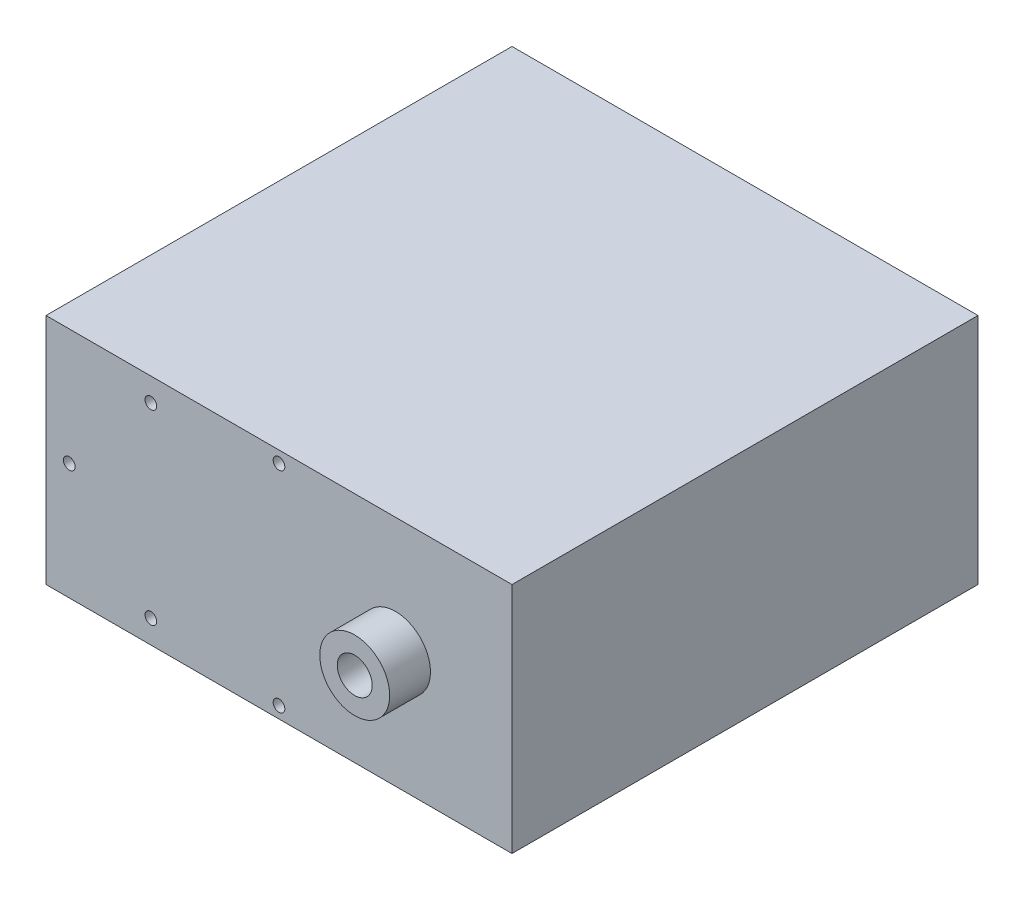
ISO-10303-21;
HEADER;
FILE_DESCRIPTION(('STEP AP214'),'2;1');
FILE_NAME('part.step','',(''),(''),'','','');
FILE_SCHEMA(('AUTOMOTIVE_DESIGN { 1 0 10303 214 1 1 1 1 }'));
ENDSEC;
DATA;
#1=APPLICATION_CONTEXT('core data for automotive mechanical design processes');
#2=APPLICATION_PROTOCOL_DEFINITION('international standard','automotive_design',2000,#1);
#3=PRODUCT_CONTEXT('',#1,'mechanical');
#4=PRODUCT('Part','Part','',(#3));
#5=PRODUCT_RELATED_PRODUCT_CATEGORY('part','',(#4));
#6=PRODUCT_DEFINITION_FORMATION('','',#4);
#7=PRODUCT_DEFINITION_CONTEXT('part definition',#1,'design');
#8=PRODUCT_DEFINITION('design','',#6,#7);
#9=PRODUCT_DEFINITION_SHAPE('','',#8);
#10=(LENGTH_UNIT() NAMED_UNIT(*) SI_UNIT(.MILLI.,.METRE.));
#11=(NAMED_UNIT(*) PLANE_ANGLE_UNIT() SI_UNIT($,.RADIAN.));
#12=(NAMED_UNIT(*) SI_UNIT($,.STERADIAN.) SOLID_ANGLE_UNIT());
#13=UNCERTAINTY_MEASURE_WITH_UNIT(LENGTH_MEASURE(1.E-05),#10,'distance_accuracy_value','');
#14=(GEOMETRIC_REPRESENTATION_CONTEXT(3) GLOBAL_UNCERTAINTY_ASSIGNED_CONTEXT((#13)) GLOBAL_UNIT_ASSIGNED_CONTEXT((#10,
#11,#12)) REPRESENTATION_CONTEXT('',''));
#15=CARTESIAN_POINT('',(0.,0.,0.));
#16=DIRECTION('',(0.,0.,1.));
#17=DIRECTION('',(1.,0.,0.));
#18=AXIS2_PLACEMENT_3D('',#15,#16,#17);
#19=CARTESIAN_POINT('',(20.,-10.,40.));
#20=DIRECTION('',(-1.,0.,0.));
#21=DIRECTION('',(0.,0.,1.));
#22=AXIS2_PLACEMENT_3D('',#19,#20,#21);
#23=PLANE('',#22);
#24=DIRECTION('',(0.,1.,0.));
#25=VECTOR('',#24,1.);
#26=CARTESIAN_POINT('',(20.,-10.,0.));
#27=LINE('',#26,#25);
#28=CARTESIAN_POINT('',(20.,-10.,0.));
#29=VERTEX_POINT('',#28);
#30=CARTESIAN_POINT('',(20.,10.,0.));
#31=VERTEX_POINT('',#30);
#32=EDGE_CURVE('E103',#29,#31,#27,.T.);
#33=ORIENTED_EDGE('',*,*,#32,.T.);
#34=DIRECTION('',(0.,0.,-1.));
#35=VECTOR('',#34,1.);
#36=CARTESIAN_POINT('',(20.,10.,40.));
#37=LINE('',#36,#35);
#38=CARTESIAN_POINT('',(20.,10.,40.));
#39=VERTEX_POINT('',#38);
#40=EDGE_CURVE('E94',#39,#31,#37,.T.);
#41=ORIENTED_EDGE('',*,*,#40,.F.);
#42=DIRECTION('',(0.,1.,0.));
#43=VECTOR('',#42,1.);
#44=CARTESIAN_POINT('',(20.,-10.,40.));
#45=LINE('',#44,#43);
#46=CARTESIAN_POINT('',(20.,-10.,40.));
#47=VERTEX_POINT('',#46);
#48=EDGE_CURVE('E88',#47,#39,#45,.T.);
#49=ORIENTED_EDGE('',*,*,#48,.F.);
#50=DIRECTION('',(0.,0.,-1.));
#51=VECTOR('',#50,1.);
#52=CARTESIAN_POINT('',(20.,-10.,40.));
#53=LINE('',#52,#51);
#54=EDGE_CURVE('E99',#47,#29,#53,.T.);
#55=ORIENTED_EDGE('',*,*,#54,.T.);
#56=EDGE_LOOP('',(#33,#41,#49,#55));
#57=FACE_BOUND('',#56,.T.);
#58=ADVANCED_FACE('F36',(#57),#23,.F.);
#59=CARTESIAN_POINT('',(-20.,10.,40.));
#60=DIRECTION('',(0.,-1.,0.));
#61=DIRECTION('',(0.,0.,-1.));
#62=AXIS2_PLACEMENT_3D('',#59,#60,#61);
#63=PLANE('',#62);
#64=DIRECTION('',(-1.,0.,0.));
#65=VECTOR('',#64,1.);
#66=CARTESIAN_POINT('',(-20.,10.,0.));
#67=LINE('',#66,#65);
#68=CARTESIAN_POINT('',(-20.,10.,0.));
#69=VERTEX_POINT('',#68);
#70=EDGE_CURVE('E93',#31,#69,#67,.T.);
#71=ORIENTED_EDGE('',*,*,#70,.T.);
#72=DIRECTION('',(0.,0.,-1.));
#73=VECTOR('',#72,1.);
#74=CARTESIAN_POINT('',(-20.,10.,40.));
#75=LINE('',#74,#73);
#76=CARTESIAN_POINT('',(-20.,10.,40.));
#77=VERTEX_POINT('',#76);
#78=EDGE_CURVE('E91',#77,#69,#75,.T.);
#79=ORIENTED_EDGE('',*,*,#78,.F.);
#80=DIRECTION('',(-1.,0.,0.));
#81=VECTOR('',#80,1.);
#82=CARTESIAN_POINT('',(-20.,10.,40.));
#83=LINE('',#82,#81);
#84=EDGE_CURVE('E83',#39,#77,#83,.T.);
#85=ORIENTED_EDGE('',*,*,#84,.F.);
#86=ORIENTED_EDGE('',*,*,#40,.T.);
#87=EDGE_LOOP('',(#71,#79,#85,#86));
#88=FACE_BOUND('',#87,.T.);
#89=ADVANCED_FACE('F92',(#88),#63,.F.);
#90=CARTESIAN_POINT('',(-20.,-10.,40.));
#91=DIRECTION('',(1.,0.,0.));
#92=DIRECTION('',(0.,0.,-1.));
#93=AXIS2_PLACEMENT_3D('',#90,#91,#92);
#94=PLANE('',#93);
#95=DIRECTION('',(0.,-1.,0.));
#96=VECTOR('',#95,1.);
#97=CARTESIAN_POINT('',(-20.,-10.,0.));
#98=LINE('',#97,#96);
#99=CARTESIAN_POINT('',(-20.,-10.,0.));
#100=VERTEX_POINT('',#99);
#101=EDGE_CURVE('E69',#69,#100,#98,.T.);
#102=ORIENTED_EDGE('',*,*,#101,.T.);
#103=DIRECTION('',(0.,0.,-1.));
#104=VECTOR('',#103,1.);
#105=CARTESIAN_POINT('',(-20.,-10.,40.));
#106=LINE('',#105,#104);
#107=CARTESIAN_POINT('',(-20.,-10.,40.));
#108=VERTEX_POINT('',#107);
#109=EDGE_CURVE('E95',#108,#100,#106,.T.);
#110=ORIENTED_EDGE('',*,*,#109,.F.);
#111=DIRECTION('',(0.,-1.,0.));
#112=VECTOR('',#111,1.);
#113=CARTESIAN_POINT('',(-20.,-10.,40.));
#114=LINE('',#113,#112);
#115=EDGE_CURVE('E86',#77,#108,#114,.T.);
#116=ORIENTED_EDGE('',*,*,#115,.F.);
#117=ORIENTED_EDGE('',*,*,#78,.T.);
#118=EDGE_LOOP('',(#102,#110,#116,#117));
#119=FACE_BOUND('',#118,.T.);
#120=ADVANCED_FACE('F97',(#119),#94,.F.);
#121=CARTESIAN_POINT('',(-20.,-10.,40.));
#122=DIRECTION('',(0.,1.,0.));
#123=DIRECTION('',(0.,0.,1.));
#124=AXIS2_PLACEMENT_3D('',#121,#122,#123);
#125=PLANE('',#124);
#126=DIRECTION('',(1.,0.,0.));
#127=VECTOR('',#126,1.);
#128=CARTESIAN_POINT('',(-20.,-10.,0.));
#129=LINE('',#128,#127);
#130=EDGE_CURVE('E75',#100,#29,#129,.T.);
#131=ORIENTED_EDGE('',*,*,#130,.T.);
#132=ORIENTED_EDGE('',*,*,#54,.F.);
#133=DIRECTION('',(1.,0.,0.));
#134=VECTOR('',#133,1.);
#135=CARTESIAN_POINT('',(-20.,-10.,40.));
#136=LINE('',#135,#134);
#137=EDGE_CURVE('E52',#108,#47,#136,.T.);
#138=ORIENTED_EDGE('',*,*,#137,.F.);
#139=ORIENTED_EDGE('',*,*,#109,.T.);
#140=EDGE_LOOP('',(#131,#132,#138,#139));
#141=FACE_BOUND('',#140,.T.);
#142=ADVANCED_FACE('F119',(#141),#125,.F.);
#143=CARTESIAN_POINT('',(0.,0.,40.));
#144=DIRECTION('',(0.,0.,-1.));
#145=DIRECTION('',(-1.,0.,0.));
#146=AXIS2_PLACEMENT_3D('',#143,#144,#145);
#147=PLANE('',#146);
#148=CARTESIAN_POINT('',(-18.,0.,40.));
#149=DIRECTION('',(0.,0.,1.));
#150=DIRECTION('',(1.,0.,0.));
#151=AXIS2_PLACEMENT_3D('',#148,#149,#150);
#152=CIRCLE('',#151,0.499999999999999);
#153=CARTESIAN_POINT('',(-17.5,0.,40.));
#154=VERTEX_POINT('',#153);
#155=EDGE_CURVE('E195',#154,#154,#152,.T.);
#156=ORIENTED_EDGE('',*,*,#155,.F.);
#157=EDGE_LOOP('',(#156));
#158=FACE_BOUND('',#157,.T.);
#159=CARTESIAN_POINT('',(-11.,8.,40.));
#160=DIRECTION('',(0.,0.,1.));
#161=DIRECTION('',(1.,0.,0.));
#162=AXIS2_PLACEMENT_3D('',#159,#160,#161);
#163=CIRCLE('',#162,0.500000000000001);
#164=CARTESIAN_POINT('',(-10.5,8.,40.));
#165=VERTEX_POINT('',#164);
#166=EDGE_CURVE('E189',#165,#165,#163,.T.);
#167=ORIENTED_EDGE('',*,*,#166,.F.);
#168=EDGE_LOOP('',(#167));
#169=FACE_BOUND('',#168,.T.);
#170=CARTESIAN_POINT('',(0.,9.,40.));
#171=DIRECTION('',(0.,0.,1.));
#172=DIRECTION('',(1.,0.,0.));
#173=AXIS2_PLACEMENT_3D('',#170,#171,#172);
#174=CIRCLE('',#173,0.5);
#175=CARTESIAN_POINT('',(0.49999999999999,9.,40.));
#176=VERTEX_POINT('',#175);
#177=EDGE_CURVE('E183',#176,#176,#174,.T.);
#178=ORIENTED_EDGE('',*,*,#177,.F.);
#179=EDGE_LOOP('',(#178));
#180=FACE_BOUND('',#179,.T.);
#181=CARTESIAN_POINT('',(-11.,-8.,40.));
#182=DIRECTION('',(0.,0.,1.));
#183=DIRECTION('',(1.,0.,0.));
#184=AXIS2_PLACEMENT_3D('',#181,#182,#183);
#185=CIRCLE('',#184,0.500000000000001);
#186=CARTESIAN_POINT('',(-10.5,-8.,40.));
#187=VERTEX_POINT('',#186);
#188=EDGE_CURVE('E177',#187,#187,#185,.T.);
#189=ORIENTED_EDGE('',*,*,#188,.F.);
#190=EDGE_LOOP('',(#189));
#191=FACE_BOUND('',#190,.T.);
#192=CARTESIAN_POINT('',(0.,-9.,40.));
#193=DIRECTION('',(0.,0.,1.));
#194=DIRECTION('',(1.,0.,0.));
#195=AXIS2_PLACEMENT_3D('',#192,#193,#194);
#196=CIRCLE('',#195,0.5);
#197=CARTESIAN_POINT('',(0.49999999999999,-9.,40.));
#198=VERTEX_POINT('',#197);
#199=EDGE_CURVE('E170',#198,#198,#196,.T.);
#200=ORIENTED_EDGE('',*,*,#199,.F.);
#201=EDGE_LOOP('',(#200));
#202=FACE_BOUND('',#201,.T.);
#203=CARTESIAN_POINT('',(9.99999999999999,0.,40.));
#204=DIRECTION('',(0.,0.,-1.));
#205=DIRECTION('',(-1.,0.,0.));
#206=AXIS2_PLACEMENT_3D('',#203,#204,#205);
#207=CIRCLE('',#206,3.);
#208=CARTESIAN_POINT('',(6.99999999999999,0.,40.));
#209=VERTEX_POINT('',#208);
#210=EDGE_CURVE('E44',#209,#209,#207,.F.);
#211=ORIENTED_EDGE('',*,*,#210,.F.);
#212=EDGE_LOOP('',(#211));
#213=FACE_BOUND('',#212,.T.);
#214=ORIENTED_EDGE('',*,*,#48,.T.);
#215=ORIENTED_EDGE('',*,*,#84,.T.);
#216=ORIENTED_EDGE('',*,*,#115,.T.);
#217=ORIENTED_EDGE('',*,*,#137,.T.);
#218=EDGE_LOOP('',(#214,#215,#216,#217));
#219=FACE_BOUND('',#218,.T.);
#220=ADVANCED_FACE('F84',(#158,#169,#180,#191,#202,#213,#219),#147,.F.);
#221=CARTESIAN_POINT('',(0.,0.,0.));
#222=DIRECTION('',(0.,0.,-1.));
#223=DIRECTION('',(-1.,0.,0.));
#224=AXIS2_PLACEMENT_3D('',#221,#222,#223);
#225=PLANE('',#224);
#226=CARTESIAN_POINT('',(-18.,0.,0.));
#227=DIRECTION('',(0.,0.,-1.));
#228=DIRECTION('',(-1.,0.,0.));
#229=AXIS2_PLACEMENT_3D('',#226,#227,#228);
#230=CIRCLE('',#229,0.499999999999999);
#231=CARTESIAN_POINT('',(-18.5,0.,0.));
#232=VERTEX_POINT('',#231);
#233=EDGE_CURVE('E224',#232,#232,#230,.T.);
#234=ORIENTED_EDGE('',*,*,#233,.F.);
#235=EDGE_LOOP('',(#234));
#236=FACE_BOUND('',#235,.T.);
#237=CARTESIAN_POINT('',(-11.,-8.,0.));
#238=DIRECTION('',(0.,0.,-1.));
#239=DIRECTION('',(-1.,0.,0.));
#240=AXIS2_PLACEMENT_3D('',#237,#238,#239);
#241=CIRCLE('',#240,0.500000000000001);
#242=CARTESIAN_POINT('',(-11.5,-8.,0.));
#243=VERTEX_POINT('',#242);
#244=EDGE_CURVE('E218',#243,#243,#241,.T.);
#245=ORIENTED_EDGE('',*,*,#244,.F.);
#246=EDGE_LOOP('',(#245));
#247=FACE_BOUND('',#246,.T.);
#248=CARTESIAN_POINT('',(0.,-9.,0.));
#249=DIRECTION('',(0.,0.,-1.));
#250=DIRECTION('',(-1.,0.,0.));
#251=AXIS2_PLACEMENT_3D('',#248,#249,#250);
#252=CIRCLE('',#251,0.5);
#253=CARTESIAN_POINT('',(-0.500000000000011,-9.,0.));
#254=VERTEX_POINT('',#253);
#255=EDGE_CURVE('E212',#254,#254,#252,.T.);
#256=ORIENTED_EDGE('',*,*,#255,.F.);
#257=EDGE_LOOP('',(#256));
#258=FACE_BOUND('',#257,.T.);
#259=CARTESIAN_POINT('',(-11.,8.,0.));
#260=DIRECTION('',(0.,0.,-1.));
#261=DIRECTION('',(-1.,0.,0.));
#262=AXIS2_PLACEMENT_3D('',#259,#260,#261);
#263=CIRCLE('',#262,0.500000000000001);
#264=CARTESIAN_POINT('',(-11.5,8.,0.));
#265=VERTEX_POINT('',#264);
#266=EDGE_CURVE('E206',#265,#265,#263,.T.);
#267=ORIENTED_EDGE('',*,*,#266,.F.);
#268=EDGE_LOOP('',(#267));
#269=FACE_BOUND('',#268,.T.);
#270=CARTESIAN_POINT('',(0.,9.,0.));
#271=DIRECTION('',(0.,0.,-1.));
#272=DIRECTION('',(-1.,0.,0.));
#273=AXIS2_PLACEMENT_3D('',#270,#271,#272);
#274=CIRCLE('',#273,0.500000000000001);
#275=CARTESIAN_POINT('',(-0.500000000000011,9.,0.));
#276=VERTEX_POINT('',#275);
#277=EDGE_CURVE('E200',#276,#276,#274,.T.);
#278=ORIENTED_EDGE('',*,*,#277,.F.);
#279=EDGE_LOOP('',(#278));
#280=FACE_BOUND('',#279,.T.);
#281=CARTESIAN_POINT('',(9.99999999999999,0.,0.));
#282=DIRECTION('',(0.,0.,-1.));
#283=DIRECTION('',(-1.,0.,0.));
#284=AXIS2_PLACEMENT_3D('',#281,#282,#283);
#285=CIRCLE('',#284,6.);
#286=CARTESIAN_POINT('',(3.99999999999999,0.,0.));
#287=VERTEX_POINT('',#286);
#288=EDGE_CURVE('E155',#287,#287,#285,.T.);
#289=ORIENTED_EDGE('',*,*,#288,.F.);
#290=EDGE_LOOP('',(#289));
#291=FACE_BOUND('',#290,.T.);
#292=ORIENTED_EDGE('',*,*,#32,.F.);
#293=ORIENTED_EDGE('',*,*,#130,.F.);
#294=ORIENTED_EDGE('',*,*,#101,.F.);
#295=ORIENTED_EDGE('',*,*,#70,.F.);
#296=EDGE_LOOP('',(#292,#293,#294,#295));
#297=FACE_BOUND('',#296,.T.);
#298=ADVANCED_FACE('F118',(#236,#247,#258,#269,#280,#291,#297),#225,.T.);
#299=CARTESIAN_POINT('',(9.99999999999999,0.,43.5));
#300=DIRECTION('',(0.,0.,1.));
#301=DIRECTION('',(1.,0.,0.));
#302=AXIS2_PLACEMENT_3D('',#299,#300,#301);
#303=PLANE('',#302);
#304=CARTESIAN_POINT('',(9.99999999999999,0.,43.5));
#305=DIRECTION('',(0.,0.,1.));
#306=DIRECTION('',(1.,0.,0.));
#307=AXIS2_PLACEMENT_3D('',#304,#305,#306);
#308=CIRCLE('',#307,3.);
#309=CARTESIAN_POINT('',(13.,0.,43.5));
#310=VERTEX_POINT('',#309);
#311=EDGE_CURVE('E106',#310,#310,#308,.T.);
#312=ORIENTED_EDGE('',*,*,#311,.T.);
#313=EDGE_LOOP('',(#312));
#314=FACE_BOUND('',#313,.T.);
#315=CARTESIAN_POINT('',(9.99999999999999,0.,43.5));
#316=DIRECTION('',(0.,0.,1.));
#317=DIRECTION('',(1.,0.,0.));
#318=AXIS2_PLACEMENT_3D('',#315,#316,#317);
#319=CIRCLE('',#318,1.5);
#320=CARTESIAN_POINT('',(11.5,0.,43.5));
#321=VERTEX_POINT('',#320);
#322=EDGE_CURVE('E148',#321,#321,#319,.T.);
#323=ORIENTED_EDGE('',*,*,#322,.F.);
#324=EDGE_LOOP('',(#323));
#325=FACE_BOUND('',#324,.T.);
#326=ADVANCED_FACE('F127',(#314,#325),#303,.T.);
#327=CARTESIAN_POINT('',(9.99999999999999,0.,43.5));
#328=DIRECTION('',(0.,0.,-1.));
#329=DIRECTION('',(-1.,0.,0.));
#330=AXIS2_PLACEMENT_3D('',#327,#328,#329);
#331=CYLINDRICAL_SURFACE('',#330,3.);
#332=ORIENTED_EDGE('',*,*,#311,.F.);
#333=EDGE_LOOP('',(#332));
#334=FACE_BOUND('',#333,.T.);
#335=ORIENTED_EDGE('',*,*,#210,.T.);
#336=EDGE_LOOP('',(#335));
#337=FACE_BOUND('',#336,.T.);
#338=ADVANCED_FACE('F115',(#334,#337),#331,.T.);
#339=CARTESIAN_POINT('',(9.99999999999999,0.,43.5));
#340=DIRECTION('',(0.,0.,-1.));
#341=DIRECTION('',(-1.,0.,0.));
#342=AXIS2_PLACEMENT_3D('',#339,#340,#341);
#343=CYLINDRICAL_SURFACE('',#342,1.5);
#344=ORIENTED_EDGE('',*,*,#322,.T.);
#345=EDGE_LOOP('',(#344));
#346=FACE_BOUND('',#345,.T.);
#347=CARTESIAN_POINT('',(9.99999999999999,0.,40.));
#348=DIRECTION('',(0.,0.,1.));
#349=DIRECTION('',(1.,0.,0.));
#350=AXIS2_PLACEMENT_3D('',#347,#348,#349);
#351=CIRCLE('',#350,1.5);
#352=CARTESIAN_POINT('',(11.5,0.,40.));
#353=VERTEX_POINT('',#352);
#354=EDGE_CURVE('E149',#353,#353,#351,.T.);
#355=ORIENTED_EDGE('',*,*,#354,.F.);
#356=EDGE_LOOP('',(#355));
#357=FACE_BOUND('',#356,.T.);
#358=ADVANCED_FACE('F136',(#346,#357),#343,.F.);
#359=ORIENTED_EDGE('',*,*,#354,.T.);
#360=EDGE_LOOP('',(#359));
#361=FACE_BOUND('',#360,.T.);
#362=ADVANCED_FACE('F122',(#361),#147,.F.);
#363=CARTESIAN_POINT('',(9.99999999999999,0.,-1.));
#364=DIRECTION('',(0.,0.,1.));
#365=DIRECTION('',(1.,0.,0.));
#366=AXIS2_PLACEMENT_3D('',#363,#364,#365);
#367=CYLINDRICAL_SURFACE('',#366,6.);
#368=CARTESIAN_POINT('',(9.99999999999999,0.,-1.));
#369=DIRECTION('',(0.,0.,-1.));
#370=DIRECTION('',(-1.,0.,0.));
#371=AXIS2_PLACEMENT_3D('',#368,#369,#370);
#372=CIRCLE('',#371,6.);
#373=CARTESIAN_POINT('',(3.99999999999999,0.,-1.));
#374=VERTEX_POINT('',#373);
#375=EDGE_CURVE('E152',#374,#374,#372,.T.);
#376=ORIENTED_EDGE('',*,*,#375,.F.);
#377=EDGE_LOOP('',(#376));
#378=FACE_BOUND('',#377,.T.);
#379=ORIENTED_EDGE('',*,*,#288,.T.);
#380=EDGE_LOOP('',(#379));
#381=FACE_BOUND('',#380,.T.);
#382=ADVANCED_FACE('F135',(#378,#381),#367,.T.);
#383=CARTESIAN_POINT('',(9.99999999999999,0.,-1.));
#384=DIRECTION('',(0.,0.,-1.));
#385=DIRECTION('',(-1.,0.,0.));
#386=AXIS2_PLACEMENT_3D('',#383,#384,#385);
#387=PLANE('',#386);
#388=CARTESIAN_POINT('',(9.99999999999999,0.,-1.));
#389=DIRECTION('',(0.,0.,-1.));
#390=DIRECTION('',(-1.,0.,0.));
#391=AXIS2_PLACEMENT_3D('',#388,#389,#390);
#392=CIRCLE('',#391,3.);
#393=CARTESIAN_POINT('',(6.99999999999999,0.,-1.));
#394=VERTEX_POINT('',#393);
#395=EDGE_CURVE('E161',#394,#394,#392,.T.);
#396=ORIENTED_EDGE('',*,*,#395,.F.);
#397=EDGE_LOOP('',(#396));
#398=FACE_BOUND('',#397,.T.);
#399=ORIENTED_EDGE('',*,*,#375,.T.);
#400=EDGE_LOOP('',(#399));
#401=FACE_BOUND('',#400,.T.);
#402=ADVANCED_FACE('F250',(#398,#401),#387,.T.);
#403=CARTESIAN_POINT('',(9.99999999999999,0.,-7.));
#404=DIRECTION('',(0.,0.,-1.));
#405=DIRECTION('',(-1.,0.,0.));
#406=AXIS2_PLACEMENT_3D('',#403,#404,#405);
#407=PLANE('',#406);
#408=CARTESIAN_POINT('',(9.99999999999999,0.,-7.));
#409=DIRECTION('',(0.,0.,-1.));
#410=DIRECTION('',(-1.,0.,0.));
#411=AXIS2_PLACEMENT_3D('',#408,#409,#410);
#412=CIRCLE('',#411,3.);
#413=CARTESIAN_POINT('',(6.99999999999999,0.,-7.));
#414=VERTEX_POINT('',#413);
#415=EDGE_CURVE('E158',#414,#414,#412,.T.);
#416=ORIENTED_EDGE('',*,*,#415,.T.);
#417=EDGE_LOOP('',(#416));
#418=FACE_BOUND('',#417,.T.);
#419=CARTESIAN_POINT('',(9.99999999999999,0.,-7.));
#420=DIRECTION('',(0.,0.,-1.));
#421=DIRECTION('',(-1.,0.,0.));
#422=AXIS2_PLACEMENT_3D('',#419,#420,#421);
#423=CIRCLE('',#422,1.);
#424=CARTESIAN_POINT('',(8.99999999999999,0.,-7.));
#425=VERTEX_POINT('',#424);
#426=EDGE_CURVE('E164',#425,#425,#423,.T.);
#427=ORIENTED_EDGE('',*,*,#426,.F.);
#428=EDGE_LOOP('',(#427));
#429=FACE_BOUND('',#428,.T.);
#430=ADVANCED_FACE('F256',(#418,#429),#407,.T.);
#431=CARTESIAN_POINT('',(9.99999999999999,0.,-7.));
#432=DIRECTION('',(0.,0.,1.));
#433=DIRECTION('',(1.,0.,0.));
#434=AXIS2_PLACEMENT_3D('',#431,#432,#433);
#435=CYLINDRICAL_SURFACE('',#434,3.);
#436=ORIENTED_EDGE('',*,*,#415,.F.);
#437=EDGE_LOOP('',(#436));
#438=FACE_BOUND('',#437,.T.);
#439=ORIENTED_EDGE('',*,*,#395,.T.);
#440=EDGE_LOOP('',(#439));
#441=FACE_BOUND('',#440,.T.);
#442=ADVANCED_FACE('F309',(#438,#441),#435,.T.);
#443=CARTESIAN_POINT('',(9.99999999999999,0.,-7.));
#444=DIRECTION('',(0.,0.,1.));
#445=DIRECTION('',(1.,0.,0.));
#446=AXIS2_PLACEMENT_3D('',#443,#444,#445);
#447=CYLINDRICAL_SURFACE('',#446,1.);
#448=ORIENTED_EDGE('',*,*,#426,.T.);
#449=EDGE_LOOP('',(#448));
#450=FACE_BOUND('',#449,.T.);
#451=CARTESIAN_POINT('',(9.99999999999999,0.,-1.));
#452=DIRECTION('',(0.,0.,-1.));
#453=DIRECTION('',(-1.,0.,0.));
#454=AXIS2_PLACEMENT_3D('',#451,#452,#453);
#455=CIRCLE('',#454,1.);
#456=CARTESIAN_POINT('',(8.99999999999999,0.,-1.));
#457=VERTEX_POINT('',#456);
#458=EDGE_CURVE('E11',#457,#457,#455,.F.);
#459=ORIENTED_EDGE('',*,*,#458,.T.);
#460=EDGE_LOOP('',(#459));
#461=FACE_BOUND('',#460,.T.);
#462=ADVANCED_FACE('F319',(#450,#461),#447,.F.);
#463=ORIENTED_EDGE('',*,*,#458,.F.);
#464=EDGE_LOOP('',(#463));
#465=FACE_BOUND('',#464,.T.);
#466=ADVANCED_FACE('F259',(#465),#387,.T.);
#467=CARTESIAN_POINT('',(0.,-9.,30.));
#468=DIRECTION('',(0.,0.,1.));
#469=DIRECTION('',(1.,0.,0.));
#470=AXIS2_PLACEMENT_3D('',#467,#468,#469);
#471=CYLINDRICAL_SURFACE('',#470,0.5);
#472=CARTESIAN_POINT('',(0.,-9.,30.));
#473=DIRECTION('',(0.,0.,1.));
#474=DIRECTION('',(1.,0.,0.));
#475=AXIS2_PLACEMENT_3D('',#472,#473,#474);
#476=CIRCLE('',#475,0.5);
#477=CARTESIAN_POINT('',(0.49999999999999,-9.,30.));
#478=VERTEX_POINT('',#477);
#479=EDGE_CURVE('E173',#478,#478,#476,.T.);
#480=ORIENTED_EDGE('',*,*,#479,.F.);
#481=EDGE_LOOP('',(#480));
#482=FACE_BOUND('',#481,.T.);
#483=ORIENTED_EDGE('',*,*,#199,.T.);
#484=EDGE_LOOP('',(#483));
#485=FACE_BOUND('',#484,.T.);
#486=ADVANCED_FACE('F336',(#482,#485),#471,.F.);
#487=CARTESIAN_POINT('',(0.,-9.,30.));
#488=DIRECTION('',(0.,0.,1.));
#489=DIRECTION('',(1.,0.,0.));
#490=AXIS2_PLACEMENT_3D('',#487,#488,#489);
#491=PLANE('',#490);
#492=ORIENTED_EDGE('',*,*,#479,.T.);
#493=EDGE_LOOP('',(#492));
#494=FACE_BOUND('',#493,.T.);
#495=ADVANCED_FACE('F350',(#494),#491,.T.);
#496=CARTESIAN_POINT('',(-11.,-8.,30.));
#497=DIRECTION('',(0.,0.,1.));
#498=DIRECTION('',(1.,0.,0.));
#499=AXIS2_PLACEMENT_3D('',#496,#497,#498);
#500=CYLINDRICAL_SURFACE('',#499,0.500000000000001);
#501=CARTESIAN_POINT('',(-11.,-8.,30.));
#502=DIRECTION('',(0.,0.,1.));
#503=DIRECTION('',(1.,0.,0.));
#504=AXIS2_PLACEMENT_3D('',#501,#502,#503);
#505=CIRCLE('',#504,0.500000000000001);
#506=CARTESIAN_POINT('',(-10.5,-8.,30.));
#507=VERTEX_POINT('',#506);
#508=EDGE_CURVE('E180',#507,#507,#505,.T.);
#509=ORIENTED_EDGE('',*,*,#508,.F.);
#510=EDGE_LOOP('',(#509));
#511=FACE_BOUND('',#510,.T.);
#512=ORIENTED_EDGE('',*,*,#188,.T.);
#513=EDGE_LOOP('',(#512));
#514=FACE_BOUND('',#513,.T.);
#515=ADVANCED_FACE('F360',(#511,#514),#500,.F.);
#516=CARTESIAN_POINT('',(-11.,-8.,30.));
#517=DIRECTION('',(0.,0.,1.));
#518=DIRECTION('',(1.,0.,0.));
#519=AXIS2_PLACEMENT_3D('',#516,#517,#518);
#520=PLANE('',#519);
#521=ORIENTED_EDGE('',*,*,#508,.T.);
#522=EDGE_LOOP('',(#521));
#523=FACE_BOUND('',#522,.T.);
#524=ADVANCED_FACE('F370',(#523),#520,.T.);
#525=CARTESIAN_POINT('',(0.,9.,30.));
#526=DIRECTION('',(0.,0.,1.));
#527=DIRECTION('',(1.,0.,0.));
#528=AXIS2_PLACEMENT_3D('',#525,#526,#527);
#529=CYLINDRICAL_SURFACE('',#528,0.5);
#530=CARTESIAN_POINT('',(0.,9.,30.));
#531=DIRECTION('',(0.,0.,1.));
#532=DIRECTION('',(1.,0.,0.));
#533=AXIS2_PLACEMENT_3D('',#530,#531,#532);
#534=CIRCLE('',#533,0.5);
#535=CARTESIAN_POINT('',(0.49999999999999,9.,30.));
#536=VERTEX_POINT('',#535);
#537=EDGE_CURVE('E186',#536,#536,#534,.T.);
#538=ORIENTED_EDGE('',*,*,#537,.F.);
#539=EDGE_LOOP('',(#538));
#540=FACE_BOUND('',#539,.T.);
#541=ORIENTED_EDGE('',*,*,#177,.T.);
#542=EDGE_LOOP('',(#541));
#543=FACE_BOUND('',#542,.T.);
#544=ADVANCED_FACE('F380',(#540,#543),#529,.F.);
#545=CARTESIAN_POINT('',(0.,9.,30.));
#546=DIRECTION('',(0.,0.,1.));
#547=DIRECTION('',(1.,0.,0.));
#548=AXIS2_PLACEMENT_3D('',#545,#546,#547);
#549=PLANE('',#548);
#550=ORIENTED_EDGE('',*,*,#537,.T.);
#551=EDGE_LOOP('',(#550));
#552=FACE_BOUND('',#551,.T.);
#553=ADVANCED_FACE('F390',(#552),#549,.T.);
#554=CARTESIAN_POINT('',(-11.,8.,30.));
#555=DIRECTION('',(0.,0.,1.));
#556=DIRECTION('',(1.,0.,0.));
#557=AXIS2_PLACEMENT_3D('',#554,#555,#556);
#558=CYLINDRICAL_SURFACE('',#557,0.500000000000001);
#559=CARTESIAN_POINT('',(-11.,8.,30.));
#560=DIRECTION('',(0.,0.,1.));
#561=DIRECTION('',(1.,0.,0.));
#562=AXIS2_PLACEMENT_3D('',#559,#560,#561);
#563=CIRCLE('',#562,0.500000000000001);
#564=CARTESIAN_POINT('',(-10.5,8.,30.));
#565=VERTEX_POINT('',#564);
#566=EDGE_CURVE('E192',#565,#565,#563,.T.);
#567=ORIENTED_EDGE('',*,*,#566,.F.);
#568=EDGE_LOOP('',(#567));
#569=FACE_BOUND('',#568,.T.);
#570=ORIENTED_EDGE('',*,*,#166,.T.);
#571=EDGE_LOOP('',(#570));
#572=FACE_BOUND('',#571,.T.);
#573=ADVANCED_FACE('F400',(#569,#572),#558,.F.);
#574=CARTESIAN_POINT('',(-11.,8.,30.));
#575=DIRECTION('',(0.,0.,1.));
#576=DIRECTION('',(1.,0.,0.));
#577=AXIS2_PLACEMENT_3D('',#574,#575,#576);
#578=PLANE('',#577);
#579=ORIENTED_EDGE('',*,*,#566,.T.);
#580=EDGE_LOOP('',(#579));
#581=FACE_BOUND('',#580,.T.);
#582=ADVANCED_FACE('F410',(#581),#578,.T.);
#583=CARTESIAN_POINT('',(-18.,0.,30.));
#584=DIRECTION('',(0.,0.,1.));
#585=DIRECTION('',(1.,0.,0.));
#586=AXIS2_PLACEMENT_3D('',#583,#584,#585);
#587=CYLINDRICAL_SURFACE('',#586,0.499999999999999);
#588=CARTESIAN_POINT('',(-18.,0.,30.));
#589=DIRECTION('',(0.,0.,1.));
#590=DIRECTION('',(1.,0.,0.));
#591=AXIS2_PLACEMENT_3D('',#588,#589,#590);
#592=CIRCLE('',#591,0.499999999999999);
#593=CARTESIAN_POINT('',(-17.5,0.,30.));
#594=VERTEX_POINT('',#593);
#595=EDGE_CURVE('E169',#594,#594,#592,.T.);
#596=ORIENTED_EDGE('',*,*,#595,.F.);
#597=EDGE_LOOP('',(#596));
#598=FACE_BOUND('',#597,.T.);
#599=ORIENTED_EDGE('',*,*,#155,.T.);
#600=EDGE_LOOP('',(#599));
#601=FACE_BOUND('',#600,.T.);
#602=ADVANCED_FACE('F420',(#598,#601),#587,.F.);
#603=CARTESIAN_POINT('',(-18.,0.,30.));
#604=DIRECTION('',(0.,0.,1.));
#605=DIRECTION('',(1.,0.,0.));
#606=AXIS2_PLACEMENT_3D('',#603,#604,#605);
#607=PLANE('',#606);
#608=ORIENTED_EDGE('',*,*,#595,.T.);
#609=EDGE_LOOP('',(#608));
#610=FACE_BOUND('',#609,.T.);
#611=ADVANCED_FACE('F430',(#610),#607,.T.);
#612=CARTESIAN_POINT('',(0.,9.,10.));
#613=DIRECTION('',(0.,0.,-1.));
#614=DIRECTION('',(-1.,0.,0.));
#615=AXIS2_PLACEMENT_3D('',#612,#613,#614);
#616=CYLINDRICAL_SURFACE('',#615,0.500000000000001);
#617=CARTESIAN_POINT('',(0.,9.,10.));
#618=DIRECTION('',(0.,0.,-1.));
#619=DIRECTION('',(-1.,0.,0.));
#620=AXIS2_PLACEMENT_3D('',#617,#618,#619);
#621=CIRCLE('',#620,0.500000000000001);
#622=CARTESIAN_POINT('',(-0.500000000000011,9.,10.));
#623=VERTEX_POINT('',#622);
#624=EDGE_CURVE('E203',#623,#623,#621,.T.);
#625=ORIENTED_EDGE('',*,*,#624,.F.);
#626=EDGE_LOOP('',(#625));
#627=FACE_BOUND('',#626,.T.);
#628=ORIENTED_EDGE('',*,*,#277,.T.);
#629=EDGE_LOOP('',(#628));
#630=FACE_BOUND('',#629,.T.);
#631=ADVANCED_FACE('F440',(#627,#630),#616,.F.);
#632=CARTESIAN_POINT('',(0.,9.,10.));
#633=DIRECTION('',(0.,0.,-1.));
#634=DIRECTION('',(-1.,0.,0.));
#635=AXIS2_PLACEMENT_3D('',#632,#633,#634);
#636=PLANE('',#635);
#637=ORIENTED_EDGE('',*,*,#624,.T.);
#638=EDGE_LOOP('',(#637));
#639=FACE_BOUND('',#638,.T.);
#640=ADVANCED_FACE('F455',(#639),#636,.T.);
#641=CARTESIAN_POINT('',(-11.,8.,10.));
#642=DIRECTION('',(0.,0.,-1.));
#643=DIRECTION('',(-1.,0.,0.));
#644=AXIS2_PLACEMENT_3D('',#641,#642,#643);
#645=CYLINDRICAL_SURFACE('',#644,0.500000000000001);
#646=CARTESIAN_POINT('',(-11.,8.,10.));
#647=DIRECTION('',(0.,0.,-1.));
#648=DIRECTION('',(-1.,0.,0.));
#649=AXIS2_PLACEMENT_3D('',#646,#647,#648);
#650=CIRCLE('',#649,0.500000000000001);
#651=CARTESIAN_POINT('',(-11.5,8.,10.));
#652=VERTEX_POINT('',#651);
#653=EDGE_CURVE('E209',#652,#652,#650,.T.);
#654=ORIENTED_EDGE('',*,*,#653,.F.);
#655=EDGE_LOOP('',(#654));
#656=FACE_BOUND('',#655,.T.);
#657=ORIENTED_EDGE('',*,*,#266,.T.);
#658=EDGE_LOOP('',(#657));
#659=FACE_BOUND('',#658,.T.);
#660=ADVANCED_FACE('F465',(#656,#659),#645,.F.);
#661=CARTESIAN_POINT('',(-11.,8.,10.));
#662=DIRECTION('',(0.,0.,-1.));
#663=DIRECTION('',(-1.,0.,0.));
#664=AXIS2_PLACEMENT_3D('',#661,#662,#663);
#665=PLANE('',#664);
#666=ORIENTED_EDGE('',*,*,#653,.T.);
#667=EDGE_LOOP('',(#666));
#668=FACE_BOUND('',#667,.T.);
#669=ADVANCED_FACE('F475',(#668),#665,.T.);
#670=CARTESIAN_POINT('',(0.,-9.,10.));
#671=DIRECTION('',(0.,0.,-1.));
#672=DIRECTION('',(-1.,0.,0.));
#673=AXIS2_PLACEMENT_3D('',#670,#671,#672);
#674=CYLINDRICAL_SURFACE('',#673,0.5);
#675=CARTESIAN_POINT('',(0.,-9.,10.));
#676=DIRECTION('',(0.,0.,-1.));
#677=DIRECTION('',(-1.,0.,0.));
#678=AXIS2_PLACEMENT_3D('',#675,#676,#677);
#679=CIRCLE('',#678,0.5);
#680=CARTESIAN_POINT('',(-0.500000000000011,-9.,10.));
#681=VERTEX_POINT('',#680);
#682=EDGE_CURVE('E215',#681,#681,#679,.T.);
#683=ORIENTED_EDGE('',*,*,#682,.F.);
#684=EDGE_LOOP('',(#683));
#685=FACE_BOUND('',#684,.T.);
#686=ORIENTED_EDGE('',*,*,#255,.T.);
#687=EDGE_LOOP('',(#686));
#688=FACE_BOUND('',#687,.T.);
#689=ADVANCED_FACE('F485',(#685,#688),#674,.F.);
#690=CARTESIAN_POINT('',(0.,-9.,10.));
#691=DIRECTION('',(0.,0.,-1.));
#692=DIRECTION('',(-1.,0.,0.));
#693=AXIS2_PLACEMENT_3D('',#690,#691,#692);
#694=PLANE('',#693);
#695=ORIENTED_EDGE('',*,*,#682,.T.);
#696=EDGE_LOOP('',(#695));
#697=FACE_BOUND('',#696,.T.);
#698=ADVANCED_FACE('F495',(#697),#694,.T.);
#699=CARTESIAN_POINT('',(-11.,-8.,10.));
#700=DIRECTION('',(0.,0.,-1.));
#701=DIRECTION('',(-1.,0.,0.));
#702=AXIS2_PLACEMENT_3D('',#699,#700,#701);
#703=CYLINDRICAL_SURFACE('',#702,0.500000000000001);
#704=CARTESIAN_POINT('',(-11.,-8.,10.));
#705=DIRECTION('',(0.,0.,-1.));
#706=DIRECTION('',(-1.,0.,0.));
#707=AXIS2_PLACEMENT_3D('',#704,#705,#706);
#708=CIRCLE('',#707,0.500000000000001);
#709=CARTESIAN_POINT('',(-11.5,-8.,10.));
#710=VERTEX_POINT('',#709);
#711=EDGE_CURVE('E221',#710,#710,#708,.T.);
#712=ORIENTED_EDGE('',*,*,#711,.F.);
#713=EDGE_LOOP('',(#712));
#714=FACE_BOUND('',#713,.T.);
#715=ORIENTED_EDGE('',*,*,#244,.T.);
#716=EDGE_LOOP('',(#715));
#717=FACE_BOUND('',#716,.T.);
#718=ADVANCED_FACE('F505',(#714,#717),#703,.F.);
#719=CARTESIAN_POINT('',(-11.,-8.,10.));
#720=DIRECTION('',(0.,0.,-1.));
#721=DIRECTION('',(-1.,0.,0.));
#722=AXIS2_PLACEMENT_3D('',#719,#720,#721);
#723=PLANE('',#722);
#724=ORIENTED_EDGE('',*,*,#711,.T.);
#725=EDGE_LOOP('',(#724));
#726=FACE_BOUND('',#725,.T.);
#727=ADVANCED_FACE('F235',(#726),#723,.T.);
#728=CARTESIAN_POINT('',(-18.,0.,10.));
#729=DIRECTION('',(0.,0.,-1.));
#730=DIRECTION('',(-1.,0.,0.));
#731=AXIS2_PLACEMENT_3D('',#728,#729,#730);
#732=CYLINDRICAL_SURFACE('',#731,0.499999999999999);
#733=CARTESIAN_POINT('',(-18.,0.,10.));
#734=DIRECTION('',(0.,0.,-1.));
#735=DIRECTION('',(-1.,0.,0.));
#736=AXIS2_PLACEMENT_3D('',#733,#734,#735);
#737=CIRCLE('',#736,0.499999999999999);
#738=CARTESIAN_POINT('',(-18.5,0.,10.));
#739=VERTEX_POINT('',#738);
#740=EDGE_CURVE('E174',#739,#739,#737,.T.);
#741=ORIENTED_EDGE('',*,*,#740,.F.);
#742=EDGE_LOOP('',(#741));
#743=FACE_BOUND('',#742,.T.);
#744=ORIENTED_EDGE('',*,*,#233,.T.);
#745=EDGE_LOOP('',(#744));
#746=FACE_BOUND('',#745,.T.);
#747=ADVANCED_FACE('F232',(#743,#746),#732,.F.);
#748=CARTESIAN_POINT('',(-18.,0.,10.));
#749=DIRECTION('',(0.,0.,-1.));
#750=DIRECTION('',(-1.,0.,0.));
#751=AXIS2_PLACEMENT_3D('',#748,#749,#750);
#752=PLANE('',#751);
#753=ORIENTED_EDGE('',*,*,#740,.T.);
#754=EDGE_LOOP('',(#753));
#755=FACE_BOUND('',#754,.T.);
#756=ADVANCED_FACE('F230',(#755),#752,.T.);
#757=CLOSED_SHELL('',(#58,#89,#120,#142,#220,#298,#326,#338,#358,#362,#382,#402,#430,#442,#462,
#466,#486,#495,#515,#524,#544,#553,#573,#582,#602,#611,#631,#640,#660,#669,#689,#698,#718,#727,
#747,#756));
#758=MANIFOLD_SOLID_BREP('B2',#757);
#759=ADVANCED_BREP_SHAPE_REPRESENTATION('',(#18,#758),#14);
#760=SHAPE_DEFINITION_REPRESENTATION(#9,#759);
ENDSEC;
END-ISO-10303-21;
